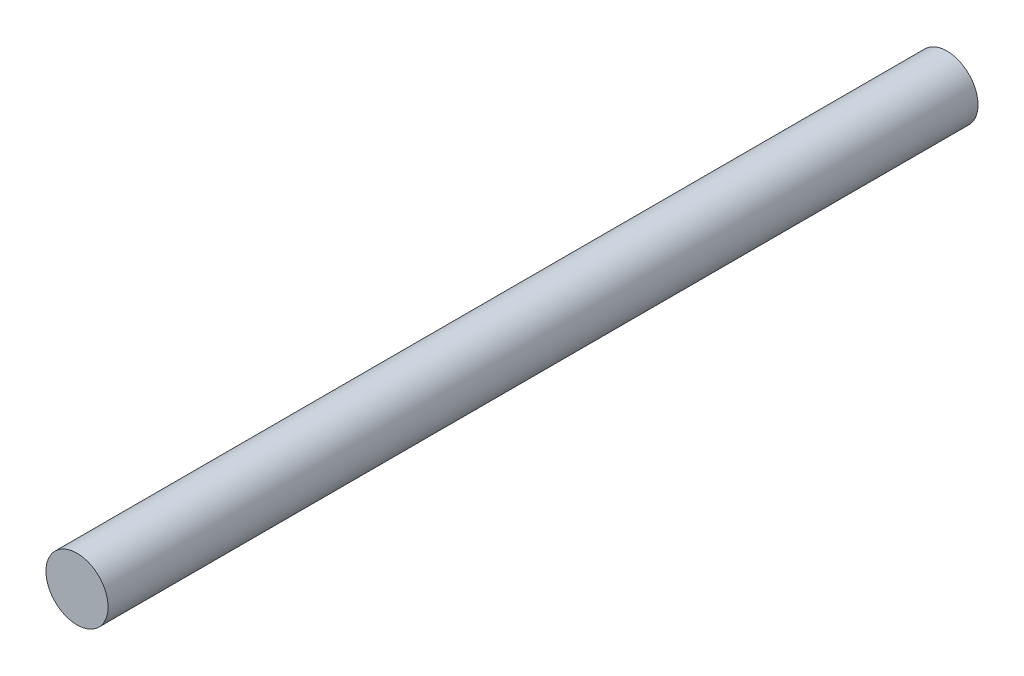
ISO-10303-21;
HEADER;
FILE_DESCRIPTION(('STEP AP214'),'2;1');
FILE_NAME('part.step','',(''),(''),'','','');
FILE_SCHEMA(('AUTOMOTIVE_DESIGN { 1 0 10303 214 1 1 1 1 }'));
ENDSEC;
DATA;
#1=APPLICATION_CONTEXT('core data for automotive mechanical design processes');
#2=APPLICATION_PROTOCOL_DEFINITION('international standard','automotive_design',2000,#1);
#3=PRODUCT_CONTEXT('',#1,'mechanical');
#4=PRODUCT('Part','Part','',(#3));
#5=PRODUCT_RELATED_PRODUCT_CATEGORY('part','',(#4));
#6=PRODUCT_DEFINITION_FORMATION('','',#4);
#7=PRODUCT_DEFINITION_CONTEXT('part definition',#1,'design');
#8=PRODUCT_DEFINITION('design','',#6,#7);
#9=PRODUCT_DEFINITION_SHAPE('','',#8);
#10=(LENGTH_UNIT() NAMED_UNIT(*) SI_UNIT(.MILLI.,.METRE.));
#11=(NAMED_UNIT(*) PLANE_ANGLE_UNIT() SI_UNIT($,.RADIAN.));
#12=(NAMED_UNIT(*) SI_UNIT($,.STERADIAN.) SOLID_ANGLE_UNIT());
#13=UNCERTAINTY_MEASURE_WITH_UNIT(LENGTH_MEASURE(1.E-05),#10,'distance_accuracy_value','');
#14=(GEOMETRIC_REPRESENTATION_CONTEXT(3) GLOBAL_UNCERTAINTY_ASSIGNED_CONTEXT((#13)) GLOBAL_UNIT_ASSIGNED_CONTEXT((#10,
#11,#12)) REPRESENTATION_CONTEXT('',''));
#15=CARTESIAN_POINT('',(0.,0.,0.));
#16=DIRECTION('',(0.,0.,1.));
#17=DIRECTION('',(1.,0.,0.));
#18=AXIS2_PLACEMENT_3D('',#15,#16,#17);
#19=CARTESIAN_POINT('',(30.,0.,-20.9999999999753));
#20=DIRECTION('',(0.,0.,1.));
#21=DIRECTION('',(1.,0.,0.));
#22=AXIS2_PLACEMENT_3D('',#19,#20,#21);
#23=CYLINDRICAL_SURFACE('',#22,1.5);
#24=CARTESIAN_POINT('',(30.,0.,-20.9999999999753));
#25=DIRECTION('',(0.,0.,1.));
#26=DIRECTION('',(1.,0.,0.));
#27=AXIS2_PLACEMENT_3D('',#24,#25,#26);
#28=CIRCLE('',#27,1.5);
#29=CARTESIAN_POINT('',(31.5,0.,-20.9999999999753));
#30=VERTEX_POINT('',#29);
#31=EDGE_CURVE('E10',#30,#30,#28,.T.);
#32=ORIENTED_EDGE('',*,*,#31,.T.);
#33=EDGE_LOOP('',(#32));
#34=FACE_BOUND('',#33,.T.);
#35=CARTESIAN_POINT('',(30.,0.,20.9999999999753));
#36=DIRECTION('',(0.,0.,1.));
#37=DIRECTION('',(1.,0.,0.));
#38=AXIS2_PLACEMENT_3D('',#35,#36,#37);
#39=CIRCLE('',#38,1.5);
#40=CARTESIAN_POINT('',(31.5,0.,20.9999999999753));
#41=VERTEX_POINT('',#40);
#42=EDGE_CURVE('E38',#41,#41,#39,.T.);
#43=ORIENTED_EDGE('',*,*,#42,.F.);
#44=EDGE_LOOP('',(#43));
#45=FACE_BOUND('',#44,.T.);
#46=ADVANCED_FACE('F32',(#34,#45),#23,.T.);
#47=CARTESIAN_POINT('',(31.5,0.,-20.9999999999753));
#48=DIRECTION('',(0.,0.,-1.));
#49=DIRECTION('',(-1.,0.,0.));
#50=AXIS2_PLACEMENT_3D('',#47,#48,#49);
#51=PLANE('',#50);
#52=ORIENTED_EDGE('',*,*,#31,.F.);
#53=EDGE_LOOP('',(#52));
#54=FACE_BOUND('',#53,.T.);
#55=ADVANCED_FACE('F47',(#54),#51,.T.);
#56=CARTESIAN_POINT('',(30.,0.,20.9999999999753));
#57=DIRECTION('',(0.,0.,1.));
#58=DIRECTION('',(1.,0.,0.));
#59=AXIS2_PLACEMENT_3D('',#56,#57,#58);
#60=PLANE('',#59);
#61=ORIENTED_EDGE('',*,*,#42,.T.);
#62=EDGE_LOOP('',(#61));
#63=FACE_BOUND('',#62,.T.);
#64=ADVANCED_FACE('F44',(#63),#60,.T.);
#65=CLOSED_SHELL('',(#46,#55,#64));
#66=MANIFOLD_SOLID_BREP('B2',#65);
#67=ADVANCED_BREP_SHAPE_REPRESENTATION('',(#18,#66),#14);
#68=SHAPE_DEFINITION_REPRESENTATION(#9,#67);
ENDSEC;
END-ISO-10303-21;
